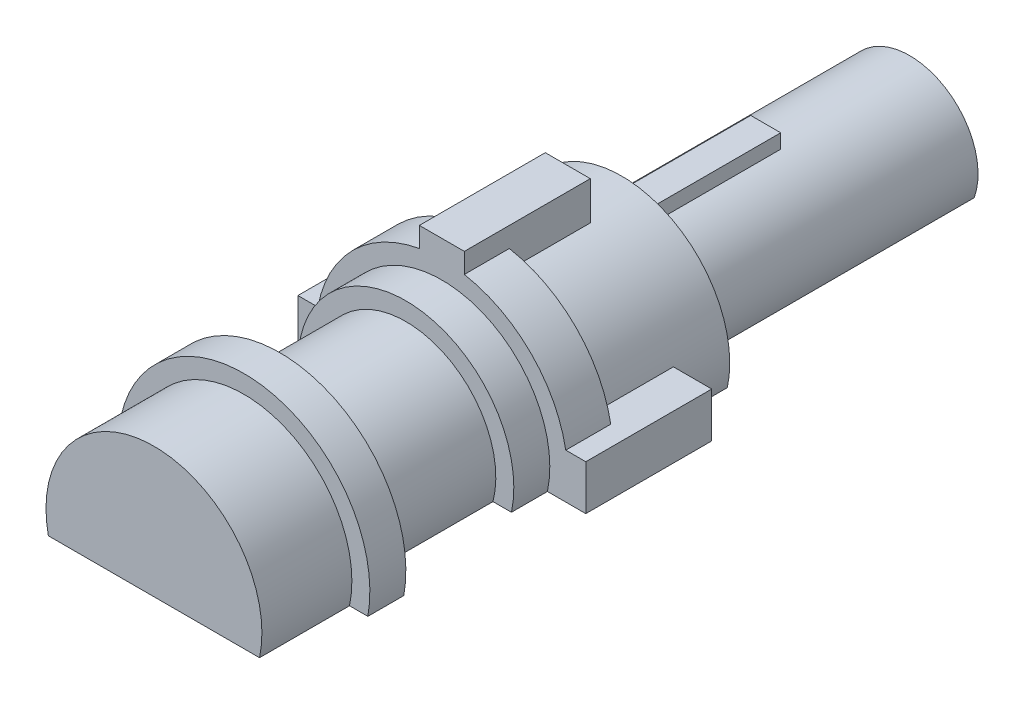
ISO-10303-21;
HEADER;
FILE_DESCRIPTION(('STEP AP214'),'2;1');
FILE_NAME('part.step','',(''),(''),'','','');
FILE_SCHEMA(('AUTOMOTIVE_DESIGN { 1 0 10303 214 1 1 1 1 }'));
ENDSEC;
DATA;
#1=APPLICATION_CONTEXT('core data for automotive mechanical design processes');
#2=APPLICATION_PROTOCOL_DEFINITION('international standard','automotive_design',2000,#1);
#3=PRODUCT_CONTEXT('',#1,'mechanical');
#4=PRODUCT('Part','Part','',(#3));
#5=PRODUCT_RELATED_PRODUCT_CATEGORY('part','',(#4));
#6=PRODUCT_DEFINITION_FORMATION('','',#4);
#7=PRODUCT_DEFINITION_CONTEXT('part definition',#1,'design');
#8=PRODUCT_DEFINITION('design','',#6,#7);
#9=PRODUCT_DEFINITION_SHAPE('','',#8);
#10=(LENGTH_UNIT() NAMED_UNIT(*) SI_UNIT(.MILLI.,.METRE.));
#11=(NAMED_UNIT(*) PLANE_ANGLE_UNIT() SI_UNIT($,.RADIAN.));
#12=(NAMED_UNIT(*) SI_UNIT($,.STERADIAN.) SOLID_ANGLE_UNIT());
#13=UNCERTAINTY_MEASURE_WITH_UNIT(LENGTH_MEASURE(1.E-05),#10,'distance_accuracy_value','');
#14=(GEOMETRIC_REPRESENTATION_CONTEXT(3) GLOBAL_UNCERTAINTY_ASSIGNED_CONTEXT((#13)) GLOBAL_UNIT_ASSIGNED_CONTEXT((#10,
#11,#12)) REPRESENTATION_CONTEXT('',''));
#15=CARTESIAN_POINT('',(0.,0.,0.));
#16=DIRECTION('',(0.,0.,1.));
#17=DIRECTION('',(1.,0.,0.));
#18=AXIS2_PLACEMENT_3D('',#15,#16,#17);
#19=CARTESIAN_POINT('',(0.,0.,0.));
#20=DIRECTION('',(0.,0.,1.));
#21=DIRECTION('',(1.,0.,0.));
#22=AXIS2_PLACEMENT_3D('',#19,#20,#21);
#23=PLANE('',#22);
#24=CARTESIAN_POINT('',(0.,0.,0.));
#25=DIRECTION('',(0.,0.,-1.));
#26=DIRECTION('',(-1.,0.,0.));
#27=AXIS2_PLACEMENT_3D('',#24,#25,#26);
#28=CIRCLE('',#27,6.);
#29=CARTESIAN_POINT('',(-5.86834729715275,-1.25,0.));
#30=VERTEX_POINT('',#29);
#31=CARTESIAN_POINT('',(-5.86834729715275,1.25,0.));
#32=VERTEX_POINT('',#31);
#33=EDGE_CURVE('E244',#30,#32,#28,.T.);
#34=ORIENTED_EDGE('',*,*,#33,.F.);
#35=DIRECTION('',(1.,0.,0.));
#36=VECTOR('',#35,1.);
#37=CARTESIAN_POINT('',(8.00000000000001,-1.25,0.));
#38=LINE('',#37,#36);
#39=CARTESIAN_POINT('',(-7.99999999999999,-1.25,0.));
#40=VERTEX_POINT('',#39);
#41=EDGE_CURVE('E400',#40,#30,#38,.T.);
#42=ORIENTED_EDGE('',*,*,#41,.F.);
#43=DIRECTION('',(0.,-1.,0.));
#44=VECTOR('',#43,1.);
#45=CARTESIAN_POINT('',(-7.99999999999999,1.25,0.));
#46=LINE('',#45,#44);
#47=CARTESIAN_POINT('',(-7.99999999999999,1.25,0.));
#48=VERTEX_POINT('',#47);
#49=EDGE_CURVE('E373',#48,#40,#46,.T.);
#50=ORIENTED_EDGE('',*,*,#49,.F.);
#51=DIRECTION('',(-1.,0.,0.));
#52=VECTOR('',#51,1.);
#53=CARTESIAN_POINT('',(-5.86834729715275,1.25,0.));
#54=LINE('',#53,#52);
#55=EDGE_CURVE('E378',#32,#48,#54,.T.);
#56=ORIENTED_EDGE('',*,*,#55,.F.);
#57=EDGE_LOOP('',(#34,#42,#50,#56));
#58=FACE_BOUND('',#57,.T.);
#59=ADVANCED_FACE('F39',(#58),#23,.F.);
#60=CARTESIAN_POINT('',(-1.25,5.86834729715275,0.));
#61=VERTEX_POINT('',#60);
#62=CARTESIAN_POINT('',(1.25,5.86834729715275,0.));
#63=VERTEX_POINT('',#62);
#64=EDGE_CURVE('E48',#61,#63,#28,.T.);
#65=ORIENTED_EDGE('',*,*,#64,.F.);
#66=DIRECTION('',(0.,-1.,0.));
#67=VECTOR('',#66,1.);
#68=CARTESIAN_POINT('',(-1.25,8.,0.));
#69=LINE('',#68,#67);
#70=CARTESIAN_POINT('',(-1.25,8.,0.));
#71=VERTEX_POINT('',#70);
#72=EDGE_CURVE('E412',#71,#61,#69,.T.);
#73=ORIENTED_EDGE('',*,*,#72,.F.);
#74=DIRECTION('',(-1.,0.,0.));
#75=VECTOR('',#74,1.);
#76=CARTESIAN_POINT('',(-1.25,8.,0.));
#77=LINE('',#76,#75);
#78=CARTESIAN_POINT('',(1.25,8.,0.));
#79=VERTEX_POINT('',#78);
#80=EDGE_CURVE('E410',#79,#71,#77,.T.);
#81=ORIENTED_EDGE('',*,*,#80,.F.);
#82=DIRECTION('',(0.,1.,0.));
#83=VECTOR('',#82,1.);
#84=CARTESIAN_POINT('',(1.25,8.,0.));
#85=LINE('',#84,#83);
#86=EDGE_CURVE('E408',#63,#79,#85,.T.);
#87=ORIENTED_EDGE('',*,*,#86,.F.);
#88=EDGE_LOOP('',(#65,#73,#81,#87));
#89=FACE_BOUND('',#88,.T.);
#90=ADVANCED_FACE('F465',(#89),#23,.F.);
#91=CARTESIAN_POINT('',(0.,0.,7.));
#92=DIRECTION('',(0.,0.,-1.));
#93=DIRECTION('',(-1.,0.,0.));
#94=AXIS2_PLACEMENT_3D('',#91,#92,#93);
#95=CYLINDRICAL_SURFACE('',#94,6.);
#96=CARTESIAN_POINT('',(0.,0.,9.));
#97=DIRECTION('',(0.,0.,1.));
#98=DIRECTION('',(1.,0.,0.));
#99=AXIS2_PLACEMENT_3D('',#96,#97,#98);
#100=CIRCLE('',#99,6.);
#101=CARTESIAN_POINT('',(5.86834729715275,-1.25,9.));
#102=VERTEX_POINT('',#101);
#103=CARTESIAN_POINT('',(-5.86834729715275,-1.25,9.));
#104=VERTEX_POINT('',#103);
#105=EDGE_CURVE('E315',#102,#104,#100,.T.);
#106=ORIENTED_EDGE('',*,*,#105,.F.);
#107=DIRECTION('',(0.,0.,-1.));
#108=VECTOR('',#107,1.);
#109=CARTESIAN_POINT('',(5.86834729715275,-1.25,23.));
#110=LINE('',#109,#108);
#111=CARTESIAN_POINT('',(5.86834729715275,-1.25,7.));
#112=VERTEX_POINT('',#111);
#113=EDGE_CURVE('E360',#102,#112,#110,.T.);
#114=ORIENTED_EDGE('',*,*,#113,.T.);
#115=CARTESIAN_POINT('',(0.,0.,7.));
#116=DIRECTION('',(0.,0.,1.));
#117=DIRECTION('',(1.,0.,0.));
#118=AXIS2_PLACEMENT_3D('',#115,#116,#117);
#119=CIRCLE('',#118,6.);
#120=CARTESIAN_POINT('',(-5.86834729715275,-1.25,7.));
#121=VERTEX_POINT('',#120);
#122=EDGE_CURVE('E361',#112,#121,#119,.T.);
#123=ORIENTED_EDGE('',*,*,#122,.T.);
#124=DIRECTION('',(0.,0.,-1.));
#125=VECTOR('',#124,1.);
#126=CARTESIAN_POINT('',(-5.86834729715275,-1.25,23.));
#127=LINE('',#126,#125);
#128=EDGE_CURVE('E369',#104,#121,#127,.T.);
#129=ORIENTED_EDGE('',*,*,#128,.F.);
#130=EDGE_LOOP('',(#106,#114,#123,#129));
#131=FACE_BOUND('',#130,.T.);
#132=ADVANCED_FACE('F504',(#131),#95,.T.);
#133=CARTESIAN_POINT('',(8.00000000000001,-1.25,7.));
#134=DIRECTION('',(0.,1.,0.));
#135=DIRECTION('',(-1.,0.,0.));
#136=AXIS2_PLACEMENT_3D('',#133,#134,#135);
#137=PLANE('',#136);
#138=DIRECTION('',(0.,0.,1.));
#139=VECTOR('',#138,1.);
#140=CARTESIAN_POINT('',(-4.84122918275927,-1.25,9.));
#141=LINE('',#140,#139);
#142=CARTESIAN_POINT('',(-4.84122918275927,-1.25,9.));
#143=VERTEX_POINT('',#142);
#144=CARTESIAN_POINT('',(-4.84122918275927,-1.25,16.));
#145=VERTEX_POINT('',#144);
#146=EDGE_CURVE('E304',#143,#145,#141,.T.);
#147=ORIENTED_EDGE('',*,*,#146,.F.);
#148=DIRECTION('',(1.,0.,0.));
#149=VECTOR('',#148,1.);
#150=CARTESIAN_POINT('',(8.00000000000001,-1.25,9.));
#151=LINE('',#150,#149);
#152=EDGE_CURVE('E448',#104,#143,#151,.T.);
#153=ORIENTED_EDGE('',*,*,#152,.F.);
#154=ORIENTED_EDGE('',*,*,#128,.T.);
#155=DIRECTION('',(1.,0.,0.));
#156=VECTOR('',#155,1.);
#157=CARTESIAN_POINT('',(8.00000000000001,-1.25,7.));
#158=LINE('',#157,#156);
#159=CARTESIAN_POINT('',(-7.99999999999999,-1.25,7.));
#160=VERTEX_POINT('',#159);
#161=EDGE_CURVE('E379',#160,#121,#158,.T.);
#162=ORIENTED_EDGE('',*,*,#161,.F.);
#163=DIRECTION('',(0.,0.,-1.));
#164=VECTOR('',#163,1.);
#165=CARTESIAN_POINT('',(-7.99999999999999,-1.25,7.));
#166=LINE('',#165,#164);
#167=EDGE_CURVE('E365',#160,#40,#166,.T.);
#168=ORIENTED_EDGE('',*,*,#167,.T.);
#169=ORIENTED_EDGE('',*,*,#41,.T.);
#170=DIRECTION('',(0.,0.,1.));
#171=VECTOR('',#170,1.);
#172=CARTESIAN_POINT('',(-5.86834729715275,-1.25,-3.));
#173=LINE('',#172,#171);
#174=CARTESIAN_POINT('',(-5.86834729715275,-1.25,-3.));
#175=VERTEX_POINT('',#174);
#176=EDGE_CURVE('E291',#175,#30,#173,.T.);
#177=ORIENTED_EDGE('',*,*,#176,.F.);
#178=DIRECTION('',(-1.,0.,0.));
#179=VECTOR('',#178,1.);
#180=CARTESIAN_POINT('',(5.86834729715275,-1.25,-3.));
#181=LINE('',#180,#179);
#182=CARTESIAN_POINT('',(-3.58852337319962,-1.25,-3.));
#183=VERTEX_POINT('',#182);
#184=EDGE_CURVE('E288',#183,#175,#181,.T.);
#185=ORIENTED_EDGE('',*,*,#184,.F.);
#186=DIRECTION('',(0.,0.,1.));
#187=VECTOR('',#186,1.);
#188=CARTESIAN_POINT('',(-3.58852337319962,-1.25,-11.));
#189=LINE('',#188,#187);
#190=CARTESIAN_POINT('',(-3.58852337319962,-1.25,-19.));
#191=VERTEX_POINT('',#190);
#192=EDGE_CURVE('E245',#191,#183,#189,.T.);
#193=ORIENTED_EDGE('',*,*,#192,.F.);
#194=DIRECTION('',(-1.,0.,0.));
#195=VECTOR('',#194,1.);
#196=CARTESIAN_POINT('',(3.58852337319962,-1.25,-19.));
#197=LINE('',#196,#195);
#198=CARTESIAN_POINT('',(3.58852337319962,-1.25,-19.));
#199=VERTEX_POINT('',#198);
#200=EDGE_CURVE('E248',#199,#191,#197,.T.);
#201=ORIENTED_EDGE('',*,*,#200,.F.);
#202=DIRECTION('',(0.,0.,1.));
#203=VECTOR('',#202,1.);
#204=CARTESIAN_POINT('',(3.58852337319962,-1.25,-11.));
#205=LINE('',#204,#203);
#206=CARTESIAN_POINT('',(3.58852337319962,-1.25,-3.));
#207=VERTEX_POINT('',#206);
#208=EDGE_CURVE('E236',#199,#207,#205,.T.);
#209=ORIENTED_EDGE('',*,*,#208,.T.);
#210=CARTESIAN_POINT('',(5.86834729715275,-1.25,-3.));
#211=VERTEX_POINT('',#210);
#212=EDGE_CURVE('E289',#211,#207,#181,.T.);
#213=ORIENTED_EDGE('',*,*,#212,.F.);
#214=DIRECTION('',(0.,0.,1.));
#215=VECTOR('',#214,1.);
#216=CARTESIAN_POINT('',(5.86834729715275,-1.25,-3.));
#217=LINE('',#216,#215);
#218=CARTESIAN_POINT('',(5.86834729715275,-1.25,0.));
#219=VERTEX_POINT('',#218);
#220=EDGE_CURVE('E297',#211,#219,#217,.T.);
#221=ORIENTED_EDGE('',*,*,#220,.T.);
#222=CARTESIAN_POINT('',(8.00000000000001,-1.25,0.));
#223=VERTEX_POINT('',#222);
#224=EDGE_CURVE('E399',#219,#223,#38,.T.);
#225=ORIENTED_EDGE('',*,*,#224,.T.);
#226=DIRECTION('',(0.,0.,-1.));
#227=VECTOR('',#226,1.);
#228=CARTESIAN_POINT('',(8.00000000000001,-1.25,7.));
#229=LINE('',#228,#227);
#230=CARTESIAN_POINT('',(8.00000000000001,-1.25,7.));
#231=VERTEX_POINT('',#230);
#232=EDGE_CURVE('E437',#231,#223,#229,.T.);
#233=ORIENTED_EDGE('',*,*,#232,.F.);
#234=EDGE_CURVE('E377',#112,#231,#158,.T.);
#235=ORIENTED_EDGE('',*,*,#234,.F.);
#236=ORIENTED_EDGE('',*,*,#113,.F.);
#237=CARTESIAN_POINT('',(4.84122918275927,-1.25,9.));
#238=VERTEX_POINT('',#237);
#239=EDGE_CURVE('E43',#238,#102,#151,.T.);
#240=ORIENTED_EDGE('',*,*,#239,.F.);
#241=DIRECTION('',(0.,0.,1.));
#242=VECTOR('',#241,1.);
#243=CARTESIAN_POINT('',(4.84122918275927,-1.25,9.));
#244=LINE('',#243,#242);
#245=CARTESIAN_POINT('',(4.84122918275927,-1.25,16.));
#246=VERTEX_POINT('',#245);
#247=EDGE_CURVE('E306',#238,#246,#244,.T.);
#248=ORIENTED_EDGE('',*,*,#247,.T.);
#249=DIRECTION('',(1.,0.,0.));
#250=VECTOR('',#249,1.);
#251=CARTESIAN_POINT('',(8.00000000000001,-1.25,16.));
#252=LINE('',#251,#250);
#253=CARTESIAN_POINT('',(6.88748865697796,-1.25,16.));
#254=VERTEX_POINT('',#253);
#255=EDGE_CURVE('E309',#246,#254,#252,.T.);
#256=ORIENTED_EDGE('',*,*,#255,.T.);
#257=DIRECTION('',(0.,0.,1.));
#258=VECTOR('',#257,1.);
#259=CARTESIAN_POINT('',(6.88748865697796,-1.25,15.5));
#260=LINE('',#259,#258);
#261=CARTESIAN_POINT('',(6.88748865697796,-1.25,18.));
#262=VERTEX_POINT('',#261);
#263=EDGE_CURVE('E324',#254,#262,#260,.T.);
#264=ORIENTED_EDGE('',*,*,#263,.T.);
#265=DIRECTION('',(1.,0.,0.));
#266=VECTOR('',#265,1.);
#267=CARTESIAN_POINT('',(-6.88748865697796,-1.25,18.));
#268=LINE('',#267,#266);
#269=CARTESIAN_POINT('',(5.86834729715275,-1.25,18.));
#270=VERTEX_POINT('',#269);
#271=EDGE_CURVE('E320',#270,#262,#268,.T.);
#272=ORIENTED_EDGE('',*,*,#271,.F.);
#273=CARTESIAN_POINT('',(5.86834729715275,-1.25,23.));
#274=VERTEX_POINT('',#273);
#275=EDGE_CURVE('E366',#274,#270,#110,.T.);
#276=ORIENTED_EDGE('',*,*,#275,.F.);
#277=DIRECTION('',(1.,0.,0.));
#278=VECTOR('',#277,1.);
#279=CARTESIAN_POINT('',(-5.86834729715275,-1.25,23.));
#280=LINE('',#279,#278);
#281=CARTESIAN_POINT('',(-5.86834729715275,-1.25,23.));
#282=VERTEX_POINT('',#281);
#283=EDGE_CURVE('E358',#282,#274,#280,.T.);
#284=ORIENTED_EDGE('',*,*,#283,.F.);
#285=CARTESIAN_POINT('',(-5.86834729715275,-1.25,18.));
#286=VERTEX_POINT('',#285);
#287=EDGE_CURVE('E370',#282,#286,#127,.T.);
#288=ORIENTED_EDGE('',*,*,#287,.T.);
#289=CARTESIAN_POINT('',(-6.88748865697796,-1.25,18.));
#290=VERTEX_POINT('',#289);
#291=EDGE_CURVE('E321',#290,#286,#268,.T.);
#292=ORIENTED_EDGE('',*,*,#291,.F.);
#293=DIRECTION('',(0.,0.,1.));
#294=VECTOR('',#293,1.);
#295=CARTESIAN_POINT('',(-6.88748865697796,-1.25,15.5));
#296=LINE('',#295,#294);
#297=CARTESIAN_POINT('',(-6.88748865697796,-1.25,16.));
#298=VERTEX_POINT('',#297);
#299=EDGE_CURVE('E323',#298,#290,#296,.T.);
#300=ORIENTED_EDGE('',*,*,#299,.F.);
#301=EDGE_CURVE('E314',#298,#145,#252,.T.);
#302=ORIENTED_EDGE('',*,*,#301,.T.);
#303=EDGE_LOOP('',(#147,#153,#154,#162,#168,#169,#177,#185,#193,#201,#209,#213,#221,#225,#233,
#235,#236,#240,#248,#256,#264,#272,#276,#284,#288,#292,#300,#302));
#304=FACE_BOUND('',#303,.T.);
#305=ADVANCED_FACE('F250',(#304),#137,.F.);
#306=CARTESIAN_POINT('',(0.,0.,4.5));
#307=DIRECTION('',(0.,0.,1.));
#308=DIRECTION('',(1.,0.,0.));
#309=AXIS2_PLACEMENT_3D('',#306,#307,#308);
#310=CIRCLE('',#309,6.);
#311=CARTESIAN_POINT('',(-1.25,5.86834729715275,4.5));
#312=VERTEX_POINT('',#311);
#313=CARTESIAN_POINT('',(-5.86834729715275,1.25,4.5));
#314=VERTEX_POINT('',#313);
#315=EDGE_CURVE('E346',#312,#314,#310,.T.);
#316=ORIENTED_EDGE('',*,*,#315,.F.);
#317=DIRECTION('',(0.,0.,-1.));
#318=VECTOR('',#317,1.);
#319=CARTESIAN_POINT('',(-1.25,5.86834729715275,7.));
#320=LINE('',#319,#318);
#321=EDGE_CURVE('E420',#312,#61,#320,.T.);
#322=ORIENTED_EDGE('',*,*,#321,.T.);
#323=ORIENTED_EDGE('',*,*,#64,.T.);
#324=DIRECTION('',(0.,0.,-1.));
#325=VECTOR('',#324,1.);
#326=CARTESIAN_POINT('',(1.25,5.86834729715275,7.));
#327=LINE('',#326,#325);
#328=CARTESIAN_POINT('',(1.25,5.86834729715275,4.5));
#329=VERTEX_POINT('',#328);
#330=EDGE_CURVE('E429',#329,#63,#327,.T.);
#331=ORIENTED_EDGE('',*,*,#330,.F.);
#332=CARTESIAN_POINT('',(5.86834729715275,1.25,4.5));
#333=VERTEX_POINT('',#332);
#334=EDGE_CURVE('E349',#333,#329,#310,.T.);
#335=ORIENTED_EDGE('',*,*,#334,.F.);
#336=DIRECTION('',(0.,0.,-1.));
#337=VECTOR('',#336,1.);
#338=CARTESIAN_POINT('',(5.86834729715275,1.25,7.));
#339=LINE('',#338,#337);
#340=CARTESIAN_POINT('',(5.86834729715275,1.25,0.));
#341=VERTEX_POINT('',#340);
#342=EDGE_CURVE('E431',#333,#341,#339,.T.);
#343=ORIENTED_EDGE('',*,*,#342,.T.);
#344=EDGE_CURVE('E294',#341,#219,#28,.T.);
#345=ORIENTED_EDGE('',*,*,#344,.T.);
#346=ORIENTED_EDGE('',*,*,#220,.F.);
#347=CARTESIAN_POINT('',(0.,0.,-3.));
#348=DIRECTION('',(0.,0.,-1.));
#349=DIRECTION('',(-1.,0.,0.));
#350=AXIS2_PLACEMENT_3D('',#347,#348,#349);
#351=CIRCLE('',#350,6.);
#352=EDGE_CURVE('E285',#175,#211,#351,.T.);
#353=ORIENTED_EDGE('',*,*,#352,.F.);
#354=ORIENTED_EDGE('',*,*,#176,.T.);
#355=ORIENTED_EDGE('',*,*,#33,.T.);
#356=DIRECTION('',(0.,0.,-1.));
#357=VECTOR('',#356,1.);
#358=CARTESIAN_POINT('',(-5.86834729715275,1.25,7.));
#359=LINE('',#358,#357);
#360=EDGE_CURVE('E418',#314,#32,#359,.T.);
#361=ORIENTED_EDGE('',*,*,#360,.F.);
#362=EDGE_LOOP('',(#316,#322,#323,#331,#335,#343,#345,#346,#353,#354,#355,#361));
#363=FACE_BOUND('',#362,.T.);
#364=ADVANCED_FACE('F459',(#363),#95,.T.);
#365=CARTESIAN_POINT('',(-7.99999999999999,1.25,7.));
#366=DIRECTION('',(1.,0.,0.));
#367=DIRECTION('',(0.,0.,-1.));
#368=AXIS2_PLACEMENT_3D('',#365,#366,#367);
#369=PLANE('',#368);
#370=ORIENTED_EDGE('',*,*,#49,.T.);
#371=ORIENTED_EDGE('',*,*,#167,.F.);
#372=DIRECTION('',(0.,-1.,0.));
#373=VECTOR('',#372,1.);
#374=CARTESIAN_POINT('',(-7.99999999999999,1.25,7.));
#375=LINE('',#374,#373);
#376=CARTESIAN_POINT('',(-7.99999999999999,1.25,7.));
#377=VERTEX_POINT('',#376);
#378=EDGE_CURVE('E374',#377,#160,#375,.T.);
#379=ORIENTED_EDGE('',*,*,#378,.F.);
#380=DIRECTION('',(0.,0.,-1.));
#381=VECTOR('',#380,1.);
#382=CARTESIAN_POINT('',(-7.99999999999999,1.25,7.));
#383=LINE('',#382,#381);
#384=EDGE_CURVE('E396',#377,#48,#383,.T.);
#385=ORIENTED_EDGE('',*,*,#384,.T.);
#386=EDGE_LOOP('',(#370,#371,#379,#385));
#387=FACE_BOUND('',#386,.T.);
#388=ADVANCED_FACE('F41',(#387),#369,.F.);
#389=CARTESIAN_POINT('',(8.00000000000001,1.25,7.));
#390=DIRECTION('',(-1.,0.,0.));
#391=DIRECTION('',(0.,0.,1.));
#392=AXIS2_PLACEMENT_3D('',#389,#390,#391);
#393=PLANE('',#392);
#394=DIRECTION('',(0.,1.,0.));
#395=VECTOR('',#394,1.);
#396=CARTESIAN_POINT('',(8.00000000000001,1.25,0.));
#397=LINE('',#396,#395);
#398=CARTESIAN_POINT('',(8.00000000000001,1.25,0.));
#399=VERTEX_POINT('',#398);
#400=EDGE_CURVE('E403',#223,#399,#397,.T.);
#401=ORIENTED_EDGE('',*,*,#400,.T.);
#402=DIRECTION('',(0.,0.,-1.));
#403=VECTOR('',#402,1.);
#404=CARTESIAN_POINT('',(8.00000000000001,1.25,7.));
#405=LINE('',#404,#403);
#406=CARTESIAN_POINT('',(8.00000000000001,1.25,7.));
#407=VERTEX_POINT('',#406);
#408=EDGE_CURVE('E434',#407,#399,#405,.T.);
#409=ORIENTED_EDGE('',*,*,#408,.F.);
#410=DIRECTION('',(0.,1.,0.));
#411=VECTOR('',#410,1.);
#412=CARTESIAN_POINT('',(8.00000000000001,1.25,7.));
#413=LINE('',#412,#411);
#414=EDGE_CURVE('E382',#231,#407,#413,.T.);
#415=ORIENTED_EDGE('',*,*,#414,.F.);
#416=ORIENTED_EDGE('',*,*,#232,.T.);
#417=EDGE_LOOP('',(#401,#409,#415,#416));
#418=FACE_BOUND('',#417,.T.);
#419=ADVANCED_FACE('F500',(#418),#393,.F.);
#420=CARTESIAN_POINT('',(8.00000000000001,1.25,7.));
#421=DIRECTION('',(0.,-1.,0.));
#422=DIRECTION('',(1.,0.,0.));
#423=AXIS2_PLACEMENT_3D('',#420,#421,#422);
#424=PLANE('',#423);
#425=DIRECTION('',(-1.,0.,0.));
#426=VECTOR('',#425,1.);
#427=CARTESIAN_POINT('',(8.00000000000001,1.25,4.5));
#428=LINE('',#427,#426);
#429=CARTESIAN_POINT('',(6.88748865697796,1.25,4.5));
#430=VERTEX_POINT('',#429);
#431=EDGE_CURVE('E353',#430,#333,#428,.T.);
#432=ORIENTED_EDGE('',*,*,#431,.F.);
#433=DIRECTION('',(0.,0.,1.));
#434=VECTOR('',#433,1.);
#435=CARTESIAN_POINT('',(6.88748865697796,1.25,4.5));
#436=LINE('',#435,#434);
#437=CARTESIAN_POINT('',(6.88748865697796,1.25,7.));
#438=VERTEX_POINT('',#437);
#439=EDGE_CURVE('E343',#430,#438,#436,.T.);
#440=ORIENTED_EDGE('',*,*,#439,.T.);
#441=DIRECTION('',(-1.,0.,0.));
#442=VECTOR('',#441,1.);
#443=CARTESIAN_POINT('',(8.00000000000001,1.25,7.));
#444=LINE('',#443,#442);
#445=EDGE_CURVE('E384',#407,#438,#444,.T.);
#446=ORIENTED_EDGE('',*,*,#445,.F.);
#447=ORIENTED_EDGE('',*,*,#408,.T.);
#448=DIRECTION('',(-1.,0.,0.));
#449=VECTOR('',#448,1.);
#450=CARTESIAN_POINT('',(8.00000000000001,1.25,0.));
#451=LINE('',#450,#449);
#452=EDGE_CURVE('E405',#399,#341,#451,.T.);
#453=ORIENTED_EDGE('',*,*,#452,.T.);
#454=ORIENTED_EDGE('',*,*,#342,.F.);
#455=EDGE_LOOP('',(#432,#440,#446,#447,#453,#454));
#456=FACE_BOUND('',#455,.T.);
#457=ADVANCED_FACE('F489',(#456),#424,.F.);
#458=CARTESIAN_POINT('',(1.25,8.,7.));
#459=DIRECTION('',(-1.,0.,0.));
#460=DIRECTION('',(0.,-1.,0.));
#461=AXIS2_PLACEMENT_3D('',#458,#459,#460);
#462=PLANE('',#461);
#463=DIRECTION('',(0.,1.,0.));
#464=VECTOR('',#463,1.);
#465=CARTESIAN_POINT('',(1.25,8.,7.));
#466=LINE('',#465,#464);
#467=CARTESIAN_POINT('',(1.25,6.88748865697796,7.));
#468=VERTEX_POINT('',#467);
#469=CARTESIAN_POINT('',(1.25,8.,7.));
#470=VERTEX_POINT('',#469);
#471=EDGE_CURVE('E387',#468,#470,#466,.T.);
#472=ORIENTED_EDGE('',*,*,#471,.F.);
#473=DIRECTION('',(0.,0.,1.));
#474=VECTOR('',#473,1.);
#475=CARTESIAN_POINT('',(1.25,6.88748865697796,4.5));
#476=LINE('',#475,#474);
#477=CARTESIAN_POINT('',(1.25,6.88748865697796,4.5));
#478=VERTEX_POINT('',#477);
#479=EDGE_CURVE('E340',#468,#478,#476,.F.);
#480=ORIENTED_EDGE('',*,*,#479,.T.);
#481=DIRECTION('',(0.,1.,0.));
#482=VECTOR('',#481,1.);
#483=CARTESIAN_POINT('',(1.25,8.,4.5));
#484=LINE('',#483,#482);
#485=EDGE_CURVE('E351',#329,#478,#484,.T.);
#486=ORIENTED_EDGE('',*,*,#485,.F.);
#487=ORIENTED_EDGE('',*,*,#330,.T.);
#488=ORIENTED_EDGE('',*,*,#86,.T.);
#489=DIRECTION('',(0.,0.,-1.));
#490=VECTOR('',#489,1.);
#491=CARTESIAN_POINT('',(1.25,8.,7.));
#492=LINE('',#491,#490);
#493=EDGE_CURVE('E426',#470,#79,#492,.T.);
#494=ORIENTED_EDGE('',*,*,#493,.F.);
#495=EDGE_LOOP('',(#472,#480,#486,#487,#488,#494));
#496=FACE_BOUND('',#495,.T.);
#497=ADVANCED_FACE('F470',(#496),#462,.F.);
#498=CARTESIAN_POINT('',(-1.25,8.,7.));
#499=DIRECTION('',(0.,-1.,0.));
#500=DIRECTION('',(0.,0.,-1.));
#501=AXIS2_PLACEMENT_3D('',#498,#499,#500);
#502=PLANE('',#501);
#503=ORIENTED_EDGE('',*,*,#80,.T.);
#504=DIRECTION('',(0.,0.,-1.));
#505=VECTOR('',#504,1.);
#506=CARTESIAN_POINT('',(-1.25,8.,7.));
#507=LINE('',#506,#505);
#508=CARTESIAN_POINT('',(-1.25,8.,7.));
#509=VERTEX_POINT('',#508);
#510=EDGE_CURVE('E423',#509,#71,#507,.T.);
#511=ORIENTED_EDGE('',*,*,#510,.F.);
#512=DIRECTION('',(-1.,0.,0.));
#513=VECTOR('',#512,1.);
#514=CARTESIAN_POINT('',(-1.25,8.,7.));
#515=LINE('',#514,#513);
#516=EDGE_CURVE('E389',#470,#509,#515,.T.);
#517=ORIENTED_EDGE('',*,*,#516,.F.);
#518=ORIENTED_EDGE('',*,*,#493,.T.);
#519=EDGE_LOOP('',(#503,#511,#517,#518));
#520=FACE_BOUND('',#519,.T.);
#521=ADVANCED_FACE('F474',(#520),#502,.F.);
#522=CARTESIAN_POINT('',(-1.25,8.,7.));
#523=DIRECTION('',(1.,0.,0.));
#524=DIRECTION('',(0.,0.,-1.));
#525=AXIS2_PLACEMENT_3D('',#522,#523,#524);
#526=PLANE('',#525);
#527=DIRECTION('',(0.,-1.,0.));
#528=VECTOR('',#527,1.);
#529=CARTESIAN_POINT('',(-1.25,8.,4.5));
#530=LINE('',#529,#528);
#531=CARTESIAN_POINT('',(-1.25,6.88748865697796,4.5));
#532=VERTEX_POINT('',#531);
#533=EDGE_CURVE('E348',#532,#312,#530,.T.);
#534=ORIENTED_EDGE('',*,*,#533,.F.);
#535=DIRECTION('',(0.,0.,1.));
#536=VECTOR('',#535,1.);
#537=CARTESIAN_POINT('',(-1.25,6.88748865697796,4.5));
#538=LINE('',#537,#536);
#539=CARTESIAN_POINT('',(-1.25,6.88748865697796,7.));
#540=VERTEX_POINT('',#539);
#541=EDGE_CURVE('E337',#532,#540,#538,.T.);
#542=ORIENTED_EDGE('',*,*,#541,.T.);
#543=DIRECTION('',(0.,-1.,0.));
#544=VECTOR('',#543,1.);
#545=CARTESIAN_POINT('',(-1.25,8.,7.));
#546=LINE('',#545,#544);
#547=EDGE_CURVE('E391',#509,#540,#546,.T.);
#548=ORIENTED_EDGE('',*,*,#547,.F.);
#549=ORIENTED_EDGE('',*,*,#510,.T.);
#550=ORIENTED_EDGE('',*,*,#72,.T.);
#551=ORIENTED_EDGE('',*,*,#321,.F.);
#552=EDGE_LOOP('',(#534,#542,#548,#549,#550,#551));
#553=FACE_BOUND('',#552,.T.);
#554=ADVANCED_FACE('F557',(#553),#526,.F.);
#555=ORIENTED_EDGE('',*,*,#275,.T.);
#556=CARTESIAN_POINT('',(0.,0.,18.));
#557=DIRECTION('',(0.,0.,1.));
#558=DIRECTION('',(1.,0.,0.));
#559=AXIS2_PLACEMENT_3D('',#556,#557,#558);
#560=CIRCLE('',#559,6.);
#561=EDGE_CURVE('E443',#270,#286,#560,.T.);
#562=ORIENTED_EDGE('',*,*,#561,.T.);
#563=ORIENTED_EDGE('',*,*,#287,.F.);
#564=CARTESIAN_POINT('',(0.,0.,23.));
#565=DIRECTION('',(0.,0.,1.));
#566=DIRECTION('',(1.,0.,0.));
#567=AXIS2_PLACEMENT_3D('',#564,#565,#566);
#568=CIRCLE('',#567,6.);
#569=EDGE_CURVE('E355',#274,#282,#568,.T.);
#570=ORIENTED_EDGE('',*,*,#569,.F.);
#571=EDGE_LOOP('',(#555,#562,#563,#570));
#572=FACE_BOUND('',#571,.T.);
#573=ADVANCED_FACE('F526',(#572),#95,.T.);
#574=CARTESIAN_POINT('',(-5.86834729715275,1.25,7.));
#575=DIRECTION('',(0.,-1.,0.));
#576=DIRECTION('',(1.,0.,0.));
#577=AXIS2_PLACEMENT_3D('',#574,#575,#576);
#578=PLANE('',#577);
#579=DIRECTION('',(-1.,0.,0.));
#580=VECTOR('',#579,1.);
#581=CARTESIAN_POINT('',(-5.86834729715275,1.25,7.));
#582=LINE('',#581,#580);
#583=CARTESIAN_POINT('',(-6.88748865697796,1.25,7.));
#584=VERTEX_POINT('',#583);
#585=EDGE_CURVE('E394',#584,#377,#582,.T.);
#586=ORIENTED_EDGE('',*,*,#585,.F.);
#587=DIRECTION('',(0.,0.,1.));
#588=VECTOR('',#587,1.);
#589=CARTESIAN_POINT('',(-6.88748865697796,1.25,4.5));
#590=LINE('',#589,#588);
#591=CARTESIAN_POINT('',(-6.88748865697796,1.25,4.5));
#592=VERTEX_POINT('',#591);
#593=EDGE_CURVE('E334',#584,#592,#590,.F.);
#594=ORIENTED_EDGE('',*,*,#593,.T.);
#595=DIRECTION('',(-1.,0.,0.));
#596=VECTOR('',#595,1.);
#597=CARTESIAN_POINT('',(-5.86834729715275,1.25,4.5));
#598=LINE('',#597,#596);
#599=EDGE_CURVE('E364',#314,#592,#598,.T.);
#600=ORIENTED_EDGE('',*,*,#599,.F.);
#601=ORIENTED_EDGE('',*,*,#360,.T.);
#602=ORIENTED_EDGE('',*,*,#55,.T.);
#603=ORIENTED_EDGE('',*,*,#384,.F.);
#604=EDGE_LOOP('',(#586,#594,#600,#601,#602,#603));
#605=FACE_BOUND('',#604,.T.);
#606=ADVANCED_FACE('F551',(#605),#578,.F.);
#607=CARTESIAN_POINT('',(0.,0.,7.));
#608=DIRECTION('',(0.,0.,1.));
#609=DIRECTION('',(1.,0.,0.));
#610=AXIS2_PLACEMENT_3D('',#607,#608,#609);
#611=PLANE('',#610);
#612=ORIENTED_EDGE('',*,*,#161,.T.);
#613=ORIENTED_EDGE('',*,*,#122,.F.);
#614=ORIENTED_EDGE('',*,*,#234,.T.);
#615=ORIENTED_EDGE('',*,*,#414,.T.);
#616=ORIENTED_EDGE('',*,*,#445,.T.);
#617=CARTESIAN_POINT('',(0.,0.,7.));
#618=DIRECTION('',(0.,0.,1.));
#619=DIRECTION('',(1.,0.,0.));
#620=AXIS2_PLACEMENT_3D('',#617,#618,#619);
#621=CIRCLE('',#620,7.);
#622=EDGE_CURVE('E332',#438,#468,#621,.T.);
#623=ORIENTED_EDGE('',*,*,#622,.T.);
#624=ORIENTED_EDGE('',*,*,#471,.T.);
#625=ORIENTED_EDGE('',*,*,#516,.T.);
#626=ORIENTED_EDGE('',*,*,#547,.T.);
#627=EDGE_CURVE('E326',#540,#584,#621,.T.);
#628=ORIENTED_EDGE('',*,*,#627,.T.);
#629=ORIENTED_EDGE('',*,*,#585,.T.);
#630=ORIENTED_EDGE('',*,*,#378,.T.);
#631=EDGE_LOOP('',(#612,#613,#614,#615,#616,#623,#624,#625,#626,#628,#629,#630));
#632=FACE_BOUND('',#631,.T.);
#633=ADVANCED_FACE('F478',(#632),#611,.T.);
#634=ORIENTED_EDGE('',*,*,#344,.F.);
#635=ORIENTED_EDGE('',*,*,#452,.F.);
#636=ORIENTED_EDGE('',*,*,#400,.F.);
#637=ORIENTED_EDGE('',*,*,#224,.F.);
#638=EDGE_LOOP('',(#634,#635,#636,#637));
#639=FACE_BOUND('',#638,.T.);
#640=ADVANCED_FACE('F495',(#639),#23,.F.);
#641=CARTESIAN_POINT('',(0.,0.,23.));
#642=DIRECTION('',(0.,0.,1.));
#643=DIRECTION('',(1.,0.,0.));
#644=AXIS2_PLACEMENT_3D('',#641,#642,#643);
#645=PLANE('',#644);
#646=ORIENTED_EDGE('',*,*,#569,.T.);
#647=ORIENTED_EDGE('',*,*,#283,.T.);
#648=EDGE_LOOP('',(#646,#647));
#649=FACE_BOUND('',#648,.T.);
#650=ADVANCED_FACE('F528',(#649),#645,.T.);
#651=CARTESIAN_POINT('',(0.,0.,4.5));
#652=DIRECTION('',(0.,0.,1.));
#653=DIRECTION('',(1.,0.,0.));
#654=AXIS2_PLACEMENT_3D('',#651,#652,#653);
#655=PLANE('',#654);
#656=CARTESIAN_POINT('',(0.,0.,4.5));
#657=DIRECTION('',(0.,0.,1.));
#658=DIRECTION('',(1.,0.,0.));
#659=AXIS2_PLACEMENT_3D('',#656,#657,#658);
#660=CIRCLE('',#659,7.);
#661=EDGE_CURVE('E328',#532,#592,#660,.T.);
#662=ORIENTED_EDGE('',*,*,#661,.F.);
#663=ORIENTED_EDGE('',*,*,#533,.T.);
#664=ORIENTED_EDGE('',*,*,#315,.T.);
#665=ORIENTED_EDGE('',*,*,#599,.T.);
#666=EDGE_LOOP('',(#662,#663,#664,#665));
#667=FACE_BOUND('',#666,.T.);
#668=ADVANCED_FACE('F530',(#667),#655,.F.);
#669=CARTESIAN_POINT('',(0.,0.,4.5));
#670=DIRECTION('',(0.,0.,1.));
#671=DIRECTION('',(1.,0.,0.));
#672=AXIS2_PLACEMENT_3D('',#669,#670,#671);
#673=CYLINDRICAL_SURFACE('',#672,7.);
#674=ORIENTED_EDGE('',*,*,#541,.F.);
#675=ORIENTED_EDGE('',*,*,#661,.T.);
#676=ORIENTED_EDGE('',*,*,#593,.F.);
#677=ORIENTED_EDGE('',*,*,#627,.F.);
#678=EDGE_LOOP('',(#674,#675,#676,#677));
#679=FACE_BOUND('',#678,.T.);
#680=ADVANCED_FACE('F537',(#679),#673,.T.);
#681=EDGE_CURVE('E331',#430,#478,#660,.T.);
#682=ORIENTED_EDGE('',*,*,#681,.F.);
#683=ORIENTED_EDGE('',*,*,#431,.T.);
#684=ORIENTED_EDGE('',*,*,#334,.T.);
#685=ORIENTED_EDGE('',*,*,#485,.T.);
#686=EDGE_LOOP('',(#682,#683,#684,#685));
#687=FACE_BOUND('',#686,.T.);
#688=ADVANCED_FACE('F486',(#687),#655,.F.);
#689=ORIENTED_EDGE('',*,*,#439,.F.);
#690=ORIENTED_EDGE('',*,*,#681,.T.);
#691=ORIENTED_EDGE('',*,*,#479,.F.);
#692=ORIENTED_EDGE('',*,*,#622,.F.);
#693=EDGE_LOOP('',(#689,#690,#691,#692));
#694=FACE_BOUND('',#693,.T.);
#695=ADVANCED_FACE('F482',(#694),#673,.T.);
#696=CARTESIAN_POINT('',(0.,0.,15.5));
#697=DIRECTION('',(0.,0.,1.));
#698=DIRECTION('',(1.,0.,0.));
#699=AXIS2_PLACEMENT_3D('',#696,#697,#698);
#700=CYLINDRICAL_SURFACE('',#699,7.);
#701=CARTESIAN_POINT('',(0.,0.,16.));
#702=DIRECTION('',(0.,0.,1.));
#703=DIRECTION('',(1.,0.,0.));
#704=AXIS2_PLACEMENT_3D('',#701,#702,#703);
#705=CIRCLE('',#704,7.);
#706=EDGE_CURVE('E445',#298,#254,#705,.F.);
#707=ORIENTED_EDGE('',*,*,#706,.F.);
#708=ORIENTED_EDGE('',*,*,#299,.T.);
#709=CARTESIAN_POINT('',(0.,0.,18.));
#710=DIRECTION('',(0.,0.,1.));
#711=DIRECTION('',(1.,0.,0.));
#712=AXIS2_PLACEMENT_3D('',#709,#710,#711);
#713=CIRCLE('',#712,7.);
#714=EDGE_CURVE('E317',#262,#290,#713,.T.);
#715=ORIENTED_EDGE('',*,*,#714,.F.);
#716=ORIENTED_EDGE('',*,*,#263,.F.);
#717=EDGE_LOOP('',(#707,#708,#715,#716));
#718=FACE_BOUND('',#717,.T.);
#719=ADVANCED_FACE('F518',(#718),#700,.T.);
#720=CARTESIAN_POINT('',(0.,0.,18.));
#721=DIRECTION('',(0.,0.,1.));
#722=DIRECTION('',(1.,0.,0.));
#723=AXIS2_PLACEMENT_3D('',#720,#721,#722);
#724=PLANE('',#723);
#725=ORIENTED_EDGE('',*,*,#561,.F.);
#726=ORIENTED_EDGE('',*,*,#271,.T.);
#727=ORIENTED_EDGE('',*,*,#714,.T.);
#728=ORIENTED_EDGE('',*,*,#291,.T.);
#729=EDGE_LOOP('',(#725,#726,#727,#728));
#730=FACE_BOUND('',#729,.T.);
#731=ADVANCED_FACE('F521',(#730),#724,.T.);
#732=CARTESIAN_POINT('',(0.,0.,9.));
#733=DIRECTION('',(0.,0.,1.));
#734=DIRECTION('',(1.,0.,0.));
#735=AXIS2_PLACEMENT_3D('',#732,#733,#734);
#736=PLANE('',#735);
#737=ORIENTED_EDGE('',*,*,#152,.T.);
#738=CARTESIAN_POINT('',(0.,0.,9.));
#739=DIRECTION('',(0.,0.,1.));
#740=DIRECTION('',(1.,0.,0.));
#741=AXIS2_PLACEMENT_3D('',#738,#739,#740);
#742=CIRCLE('',#741,5.);
#743=EDGE_CURVE('E301',#238,#143,#742,.T.);
#744=ORIENTED_EDGE('',*,*,#743,.F.);
#745=ORIENTED_EDGE('',*,*,#239,.T.);
#746=ORIENTED_EDGE('',*,*,#105,.T.);
#747=EDGE_LOOP('',(#737,#744,#745,#746));
#748=FACE_BOUND('',#747,.T.);
#749=ADVANCED_FACE('F506',(#748),#736,.T.);
#750=CARTESIAN_POINT('',(0.,0.,16.));
#751=DIRECTION('',(0.,0.,1.));
#752=DIRECTION('',(1.,0.,0.));
#753=AXIS2_PLACEMENT_3D('',#750,#751,#752);
#754=PLANE('',#753);
#755=ORIENTED_EDGE('',*,*,#706,.T.);
#756=ORIENTED_EDGE('',*,*,#255,.F.);
#757=CARTESIAN_POINT('',(0.,0.,16.));
#758=DIRECTION('',(0.,0.,1.));
#759=DIRECTION('',(1.,0.,0.));
#760=AXIS2_PLACEMENT_3D('',#757,#758,#759);
#761=CIRCLE('',#760,5.);
#762=EDGE_CURVE('E300',#246,#145,#761,.T.);
#763=ORIENTED_EDGE('',*,*,#762,.T.);
#764=ORIENTED_EDGE('',*,*,#301,.F.);
#765=EDGE_LOOP('',(#755,#756,#763,#764));
#766=FACE_BOUND('',#765,.T.);
#767=ADVANCED_FACE('F595',(#766),#754,.F.);
#768=CARTESIAN_POINT('',(0.,0.,9.));
#769=DIRECTION('',(0.,0.,1.));
#770=DIRECTION('',(1.,0.,0.));
#771=AXIS2_PLACEMENT_3D('',#768,#769,#770);
#772=CYLINDRICAL_SURFACE('',#771,5.);
#773=ORIENTED_EDGE('',*,*,#762,.F.);
#774=ORIENTED_EDGE('',*,*,#247,.F.);
#775=ORIENTED_EDGE('',*,*,#743,.T.);
#776=ORIENTED_EDGE('',*,*,#146,.T.);
#777=EDGE_LOOP('',(#773,#774,#775,#776));
#778=FACE_BOUND('',#777,.T.);
#779=ADVANCED_FACE('F511',(#778),#772,.T.);
#780=CARTESIAN_POINT('',(0.,0.,-3.));
#781=DIRECTION('',(0.,0.,-1.));
#782=DIRECTION('',(-1.,0.,0.));
#783=AXIS2_PLACEMENT_3D('',#780,#781,#782);
#784=PLANE('',#783);
#785=CARTESIAN_POINT('',(0.,0.,-3.));
#786=DIRECTION('',(0.,0.,-1.));
#787=DIRECTION('',(-1.,0.,0.));
#788=AXIS2_PLACEMENT_3D('',#785,#786,#787);
#789=CIRCLE('',#788,3.8);
#790=CARTESIAN_POINT('',(0.833333333333333,3.70749990634599,-3.));
#791=VERTEX_POINT('',#790);
#792=EDGE_CURVE('E56',#791,#207,#789,.T.);
#793=ORIENTED_EDGE('',*,*,#792,.F.);
#794=DIRECTION('',(0.,-1.,0.));
#795=VECTOR('',#794,1.);
#796=CARTESIAN_POINT('',(0.833333333333333,3.70749990634599,-3.));
#797=LINE('',#796,#795);
#798=CARTESIAN_POINT('',(0.833333333333333,4.5,-3.));
#799=VERTEX_POINT('',#798);
#800=EDGE_CURVE('E60',#799,#791,#797,.T.);
#801=ORIENTED_EDGE('',*,*,#800,.F.);
#802=DIRECTION('',(1.,0.,0.));
#803=VECTOR('',#802,1.);
#804=CARTESIAN_POINT('',(-0.833333333333333,4.5,-3.));
#805=LINE('',#804,#803);
#806=CARTESIAN_POINT('',(-0.833333333333333,4.5,-3.));
#807=VERTEX_POINT('',#806);
#808=EDGE_CURVE('E271',#807,#799,#805,.T.);
#809=ORIENTED_EDGE('',*,*,#808,.F.);
#810=DIRECTION('',(0.,1.,0.));
#811=VECTOR('',#810,1.);
#812=CARTESIAN_POINT('',(-0.833333333333333,3.70749990634599,-3.));
#813=LINE('',#812,#811);
#814=CARTESIAN_POINT('',(-0.833333333333335,3.70749990634599,-3.));
#815=VERTEX_POINT('',#814);
#816=EDGE_CURVE('E268',#815,#807,#813,.T.);
#817=ORIENTED_EDGE('',*,*,#816,.F.);
#818=CARTESIAN_POINT('',(0.,0.,-3.));
#819=DIRECTION('',(0.,0.,-1.));
#820=DIRECTION('',(-1.,0.,0.));
#821=AXIS2_PLACEMENT_3D('',#818,#819,#820);
#822=CIRCLE('',#821,3.8);
#823=EDGE_CURVE('E265',#183,#815,#822,.T.);
#824=ORIENTED_EDGE('',*,*,#823,.F.);
#825=ORIENTED_EDGE('',*,*,#184,.T.);
#826=ORIENTED_EDGE('',*,*,#352,.T.);
#827=ORIENTED_EDGE('',*,*,#212,.T.);
#828=EDGE_LOOP('',(#793,#801,#809,#817,#824,#825,#826,#827));
#829=FACE_BOUND('',#828,.T.);
#830=ADVANCED_FACE('F607',(#829),#784,.T.);
#831=CARTESIAN_POINT('',(0.,0.,-11.));
#832=DIRECTION('',(0.,0.,1.));
#833=DIRECTION('',(1.,0.,0.));
#834=AXIS2_PLACEMENT_3D('',#831,#832,#833);
#835=CYLINDRICAL_SURFACE('',#834,3.8);
#836=ORIENTED_EDGE('',*,*,#792,.T.);
#837=ORIENTED_EDGE('',*,*,#208,.F.);
#838=CARTESIAN_POINT('',(0.,0.,-19.));
#839=DIRECTION('',(0.,0.,-1.));
#840=DIRECTION('',(-1.,0.,0.));
#841=AXIS2_PLACEMENT_3D('',#838,#839,#840);
#842=CIRCLE('',#841,3.8);
#843=EDGE_CURVE('E241',#191,#199,#842,.T.);
#844=ORIENTED_EDGE('',*,*,#843,.F.);
#845=ORIENTED_EDGE('',*,*,#192,.T.);
#846=ORIENTED_EDGE('',*,*,#823,.T.);
#847=DIRECTION('',(0.,0.,1.));
#848=VECTOR('',#847,1.);
#849=CARTESIAN_POINT('',(-0.833333333333335,3.70749990634599,-11.));
#850=LINE('',#849,#848);
#851=CARTESIAN_POINT('',(-0.833333333333335,3.70749990634599,-11.));
#852=VERTEX_POINT('',#851);
#853=EDGE_CURVE('E281',#852,#815,#850,.T.);
#854=ORIENTED_EDGE('',*,*,#853,.F.);
#855=CARTESIAN_POINT('',(0.,0.,-11.));
#856=DIRECTION('',(0.,0.,-1.));
#857=DIRECTION('',(-1.,0.,0.));
#858=AXIS2_PLACEMENT_3D('',#855,#856,#857);
#859=CIRCLE('',#858,3.8);
#860=CARTESIAN_POINT('',(0.833333333333333,3.70749990634599,-11.));
#861=VERTEX_POINT('',#860);
#862=EDGE_CURVE('E11',#852,#861,#859,.T.);
#863=ORIENTED_EDGE('',*,*,#862,.T.);
#864=DIRECTION('',(0.,0.,1.));
#865=VECTOR('',#864,1.);
#866=CARTESIAN_POINT('',(0.833333333333333,3.70749990634599,-11.));
#867=LINE('',#866,#865);
#868=EDGE_CURVE('E263',#861,#791,#867,.T.);
#869=ORIENTED_EDGE('',*,*,#868,.T.);
#870=EDGE_LOOP('',(#836,#837,#844,#845,#846,#854,#863,#869));
#871=FACE_BOUND('',#870,.T.);
#872=ADVANCED_FACE('F238',(#871),#835,.T.);
#873=CARTESIAN_POINT('',(-0.833333333333333,3.70749990634599,-11.));
#874=DIRECTION('',(1.,0.,0.));
#875=DIRECTION('',(0.,1.,0.));
#876=AXIS2_PLACEMENT_3D('',#873,#874,#875);
#877=PLANE('',#876);
#878=ORIENTED_EDGE('',*,*,#816,.T.);
#879=DIRECTION('',(0.,0.,1.));
#880=VECTOR('',#879,1.);
#881=CARTESIAN_POINT('',(-0.833333333333333,4.5,-11.));
#882=LINE('',#881,#880);
#883=CARTESIAN_POINT('',(-0.833333333333333,4.5,-11.));
#884=VERTEX_POINT('',#883);
#885=EDGE_CURVE('E278',#884,#807,#882,.T.);
#886=ORIENTED_EDGE('',*,*,#885,.F.);
#887=DIRECTION('',(0.,1.,0.));
#888=VECTOR('',#887,1.);
#889=CARTESIAN_POINT('',(-0.833333333333333,3.70749990634599,-11.));
#890=LINE('',#889,#888);
#891=EDGE_CURVE('E257',#852,#884,#890,.T.);
#892=ORIENTED_EDGE('',*,*,#891,.F.);
#893=ORIENTED_EDGE('',*,*,#853,.T.);
#894=EDGE_LOOP('',(#878,#886,#892,#893));
#895=FACE_BOUND('',#894,.T.);
#896=ADVANCED_FACE('F656',(#895),#877,.F.);
#897=CARTESIAN_POINT('',(-0.833333333333333,4.5,-11.));
#898=DIRECTION('',(0.,-1.,0.));
#899=DIRECTION('',(0.,0.,-1.));
#900=AXIS2_PLACEMENT_3D('',#897,#898,#899);
#901=PLANE('',#900);
#902=ORIENTED_EDGE('',*,*,#808,.T.);
#903=DIRECTION('',(0.,0.,1.));
#904=VECTOR('',#903,1.);
#905=CARTESIAN_POINT('',(0.833333333333333,4.5,-11.));
#906=LINE('',#905,#904);
#907=CARTESIAN_POINT('',(0.833333333333333,4.5,-11.));
#908=VERTEX_POINT('',#907);
#909=EDGE_CURVE('E275',#908,#799,#906,.T.);
#910=ORIENTED_EDGE('',*,*,#909,.F.);
#911=DIRECTION('',(1.,0.,0.));
#912=VECTOR('',#911,1.);
#913=CARTESIAN_POINT('',(-0.833333333333333,4.5,-11.));
#914=LINE('',#913,#912);
#915=EDGE_CURVE('E259',#884,#908,#914,.T.);
#916=ORIENTED_EDGE('',*,*,#915,.F.);
#917=ORIENTED_EDGE('',*,*,#885,.T.);
#918=EDGE_LOOP('',(#902,#910,#916,#917));
#919=FACE_BOUND('',#918,.T.);
#920=ADVANCED_FACE('F652',(#919),#901,.F.);
#921=CARTESIAN_POINT('',(0.833333333333333,3.70749990634599,-11.));
#922=DIRECTION('',(-1.,0.,0.));
#923=DIRECTION('',(0.,0.,1.));
#924=AXIS2_PLACEMENT_3D('',#921,#922,#923);
#925=PLANE('',#924);
#926=ORIENTED_EDGE('',*,*,#800,.T.);
#927=ORIENTED_EDGE('',*,*,#868,.F.);
#928=DIRECTION('',(0.,-1.,0.));
#929=VECTOR('',#928,1.);
#930=CARTESIAN_POINT('',(0.833333333333333,3.70749990634599,-11.));
#931=LINE('',#930,#929);
#932=EDGE_CURVE('E261',#908,#861,#931,.T.);
#933=ORIENTED_EDGE('',*,*,#932,.F.);
#934=ORIENTED_EDGE('',*,*,#909,.T.);
#935=EDGE_LOOP('',(#926,#927,#933,#934));
#936=FACE_BOUND('',#935,.T.);
#937=ADVANCED_FACE('F655',(#936),#925,.F.);
#938=CARTESIAN_POINT('',(0.,0.,-11.));
#939=DIRECTION('',(0.,0.,-1.));
#940=DIRECTION('',(-1.,0.,0.));
#941=AXIS2_PLACEMENT_3D('',#938,#939,#940);
#942=PLANE('',#941);
#943=ORIENTED_EDGE('',*,*,#862,.F.);
#944=ORIENTED_EDGE('',*,*,#891,.T.);
#945=ORIENTED_EDGE('',*,*,#915,.T.);
#946=ORIENTED_EDGE('',*,*,#932,.T.);
#947=EDGE_LOOP('',(#943,#944,#945,#946));
#948=FACE_BOUND('',#947,.T.);
#949=ADVANCED_FACE('F674',(#948),#942,.T.);
#950=CARTESIAN_POINT('',(0.,0.,-19.));
#951=DIRECTION('',(0.,0.,-1.));
#952=DIRECTION('',(-1.,0.,0.));
#953=AXIS2_PLACEMENT_3D('',#950,#951,#952);
#954=PLANE('',#953);
#955=ORIENTED_EDGE('',*,*,#843,.T.);
#956=ORIENTED_EDGE('',*,*,#200,.T.);
#957=EDGE_LOOP('',(#955,#956));
#958=FACE_BOUND('',#957,.T.);
#959=ADVANCED_FACE('F254',(#958),#954,.T.);
#960=CLOSED_SHELL('',(#59,#90,#132,#305,#364,#388,#419,#457,#497,#521,#554,#573,#606,#633,#640,
#650,#668,#680,#688,#695,#719,#731,#749,#767,#779,#830,#872,#896,#920,#937,#949,#959));
#961=MANIFOLD_SOLID_BREP('B2',#960);
#962=ADVANCED_BREP_SHAPE_REPRESENTATION('',(#18,#961),#14);
#963=SHAPE_DEFINITION_REPRESENTATION(#9,#962);
ENDSEC;
END-ISO-10303-21;
